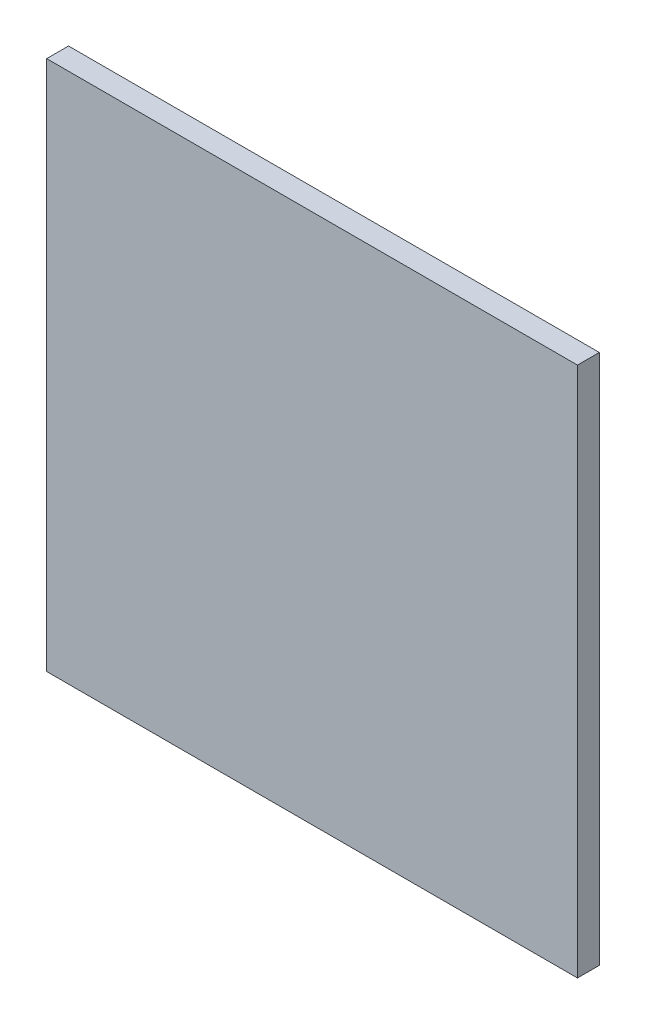
ISO-10303-21;
HEADER;
FILE_DESCRIPTION(('STEP AP214'),'2;1');
FILE_NAME('part.step','',(''),(''),'','','');
FILE_SCHEMA(('AUTOMOTIVE_DESIGN { 1 0 10303 214 1 1 1 1 }'));
ENDSEC;
DATA;
#1=APPLICATION_CONTEXT('core data for automotive mechanical design processes');
#2=APPLICATION_PROTOCOL_DEFINITION('international standard','automotive_design',2000,#1);
#3=PRODUCT_CONTEXT('',#1,'mechanical');
#4=PRODUCT('Part','Part','',(#3));
#5=PRODUCT_RELATED_PRODUCT_CATEGORY('part','',(#4));
#6=PRODUCT_DEFINITION_FORMATION('','',#4);
#7=PRODUCT_DEFINITION_CONTEXT('part definition',#1,'design');
#8=PRODUCT_DEFINITION('design','',#6,#7);
#9=PRODUCT_DEFINITION_SHAPE('','',#8);
#10=(LENGTH_UNIT() NAMED_UNIT(*) SI_UNIT(.MILLI.,.METRE.));
#11=(NAMED_UNIT(*) PLANE_ANGLE_UNIT() SI_UNIT($,.RADIAN.));
#12=(NAMED_UNIT(*) SI_UNIT($,.STERADIAN.) SOLID_ANGLE_UNIT());
#13=UNCERTAINTY_MEASURE_WITH_UNIT(LENGTH_MEASURE(1.E-05),#10,'distance_accuracy_value','');
#14=(GEOMETRIC_REPRESENTATION_CONTEXT(3) GLOBAL_UNCERTAINTY_ASSIGNED_CONTEXT((#13)) GLOBAL_UNIT_ASSIGNED_CONTEXT((#10,
#11,#12)) REPRESENTATION_CONTEXT('',''));
#15=CARTESIAN_POINT('',(0.,0.,0.));
#16=DIRECTION('',(0.,0.,1.));
#17=DIRECTION('',(1.,0.,0.));
#18=AXIS2_PLACEMENT_3D('',#15,#16,#17);
#19=CARTESIAN_POINT('',(170.,170.,14.));
#20=DIRECTION('',(-1.,0.,0.));
#21=DIRECTION('',(0.,-1.,0.));
#22=AXIS2_PLACEMENT_3D('',#19,#20,#21);
#23=PLANE('',#22);
#24=DIRECTION('',(0.,1.,0.));
#25=VECTOR('',#24,1.);
#26=CARTESIAN_POINT('',(170.,170.,0.));
#27=LINE('',#26,#25);
#28=CARTESIAN_POINT('',(170.,-170.,0.));
#29=VERTEX_POINT('',#28);
#30=CARTESIAN_POINT('',(170.,170.,0.));
#31=VERTEX_POINT('',#30);
#32=EDGE_CURVE('E98',#29,#31,#27,.T.);
#33=ORIENTED_EDGE('',*,*,#32,.T.);
#34=DIRECTION('',(0.,0.,-1.));
#35=VECTOR('',#34,1.);
#36=CARTESIAN_POINT('',(170.,170.,14.));
#37=LINE('',#36,#35);
#38=CARTESIAN_POINT('',(170.,170.,14.));
#39=VERTEX_POINT('',#38);
#40=EDGE_CURVE('E11',#39,#31,#37,.T.);
#41=ORIENTED_EDGE('',*,*,#40,.F.);
#42=DIRECTION('',(0.,1.,0.));
#43=VECTOR('',#42,1.);
#44=CARTESIAN_POINT('',(170.,170.,14.));
#45=LINE('',#44,#43);
#46=CARTESIAN_POINT('',(170.,-170.,14.));
#47=VERTEX_POINT('',#46);
#48=EDGE_CURVE('E86',#47,#39,#45,.T.);
#49=ORIENTED_EDGE('',*,*,#48,.F.);
#50=DIRECTION('',(0.,0.,-1.));
#51=VECTOR('',#50,1.);
#52=CARTESIAN_POINT('',(170.,-170.,14.));
#53=LINE('',#52,#51);
#54=EDGE_CURVE('E94',#47,#29,#53,.T.);
#55=ORIENTED_EDGE('',*,*,#54,.T.);
#56=EDGE_LOOP('',(#33,#41,#49,#55));
#57=FACE_BOUND('',#56,.T.);
#58=ADVANCED_FACE('F35',(#57),#23,.F.);
#59=CARTESIAN_POINT('',(-170.,170.,14.));
#60=DIRECTION('',(0.,-1.,0.));
#61=DIRECTION('',(0.,0.,-1.));
#62=AXIS2_PLACEMENT_3D('',#59,#60,#61);
#63=PLANE('',#62);
#64=DIRECTION('',(-1.,0.,0.));
#65=VECTOR('',#64,1.);
#66=CARTESIAN_POINT('',(-170.,170.,0.));
#67=LINE('',#66,#65);
#68=CARTESIAN_POINT('',(-170.,170.,0.));
#69=VERTEX_POINT('',#68);
#70=EDGE_CURVE('E90',#31,#69,#67,.T.);
#71=ORIENTED_EDGE('',*,*,#70,.T.);
#72=DIRECTION('',(0.,0.,-1.));
#73=VECTOR('',#72,1.);
#74=CARTESIAN_POINT('',(-170.,170.,14.));
#75=LINE('',#74,#73);
#76=CARTESIAN_POINT('',(-170.,170.,14.));
#77=VERTEX_POINT('',#76);
#78=EDGE_CURVE('E43',#77,#69,#75,.T.);
#79=ORIENTED_EDGE('',*,*,#78,.F.);
#80=DIRECTION('',(-1.,0.,0.));
#81=VECTOR('',#80,1.);
#82=CARTESIAN_POINT('',(-170.,170.,14.));
#83=LINE('',#82,#81);
#84=EDGE_CURVE('E81',#39,#77,#83,.T.);
#85=ORIENTED_EDGE('',*,*,#84,.F.);
#86=ORIENTED_EDGE('',*,*,#40,.T.);
#87=EDGE_LOOP('',(#71,#79,#85,#86));
#88=FACE_BOUND('',#87,.T.);
#89=ADVANCED_FACE('F89',(#88),#63,.F.);
#90=CARTESIAN_POINT('',(-170.,170.,14.));
#91=DIRECTION('',(1.,0.,0.));
#92=DIRECTION('',(0.,1.,0.));
#93=AXIS2_PLACEMENT_3D('',#90,#91,#92);
#94=PLANE('',#93);
#95=DIRECTION('',(0.,-1.,0.));
#96=VECTOR('',#95,1.);
#97=CARTESIAN_POINT('',(-170.,170.,0.));
#98=LINE('',#97,#96);
#99=CARTESIAN_POINT('',(-170.,-170.,0.));
#100=VERTEX_POINT('',#99);
#101=EDGE_CURVE('E68',#69,#100,#98,.T.);
#102=ORIENTED_EDGE('',*,*,#101,.T.);
#103=DIRECTION('',(0.,0.,-1.));
#104=VECTOR('',#103,1.);
#105=CARTESIAN_POINT('',(-170.,-170.,14.));
#106=LINE('',#105,#104);
#107=CARTESIAN_POINT('',(-170.,-170.,14.));
#108=VERTEX_POINT('',#107);
#109=EDGE_CURVE('E91',#108,#100,#106,.T.);
#110=ORIENTED_EDGE('',*,*,#109,.F.);
#111=DIRECTION('',(0.,-1.,0.));
#112=VECTOR('',#111,1.);
#113=CARTESIAN_POINT('',(-170.,170.,14.));
#114=LINE('',#113,#112);
#115=EDGE_CURVE('E84',#77,#108,#114,.T.);
#116=ORIENTED_EDGE('',*,*,#115,.F.);
#117=ORIENTED_EDGE('',*,*,#78,.T.);
#118=EDGE_LOOP('',(#102,#110,#116,#117));
#119=FACE_BOUND('',#118,.T.);
#120=ADVANCED_FACE('F92',(#119),#94,.F.);
#121=CARTESIAN_POINT('',(-170.,-170.,14.));
#122=DIRECTION('',(0.,1.,0.));
#123=DIRECTION('',(0.,0.,1.));
#124=AXIS2_PLACEMENT_3D('',#121,#122,#123);
#125=PLANE('',#124);
#126=DIRECTION('',(1.,0.,0.));
#127=VECTOR('',#126,1.);
#128=CARTESIAN_POINT('',(-170.,-170.,0.));
#129=LINE('',#128,#127);
#130=EDGE_CURVE('E74',#100,#29,#129,.T.);
#131=ORIENTED_EDGE('',*,*,#130,.T.);
#132=ORIENTED_EDGE('',*,*,#54,.F.);
#133=DIRECTION('',(1.,0.,0.));
#134=VECTOR('',#133,1.);
#135=CARTESIAN_POINT('',(-170.,-170.,14.));
#136=LINE('',#135,#134);
#137=EDGE_CURVE('E51',#108,#47,#136,.T.);
#138=ORIENTED_EDGE('',*,*,#137,.F.);
#139=ORIENTED_EDGE('',*,*,#109,.T.);
#140=EDGE_LOOP('',(#131,#132,#138,#139));
#141=FACE_BOUND('',#140,.T.);
#142=ADVANCED_FACE('F105',(#141),#125,.F.);
#143=CARTESIAN_POINT('',(0.,0.,14.));
#144=DIRECTION('',(0.,0.,1.));
#145=DIRECTION('',(1.,0.,0.));
#146=AXIS2_PLACEMENT_3D('',#143,#144,#145);
#147=PLANE('',#146);
#148=ORIENTED_EDGE('',*,*,#48,.T.);
#149=ORIENTED_EDGE('',*,*,#84,.T.);
#150=ORIENTED_EDGE('',*,*,#115,.T.);
#151=ORIENTED_EDGE('',*,*,#137,.T.);
#152=EDGE_LOOP('',(#148,#149,#150,#151));
#153=FACE_BOUND('',#152,.T.);
#154=ADVANCED_FACE('F82',(#153),#147,.T.);
#155=CARTESIAN_POINT('',(0.,0.,0.));
#156=DIRECTION('',(0.,0.,1.));
#157=DIRECTION('',(1.,0.,0.));
#158=AXIS2_PLACEMENT_3D('',#155,#156,#157);
#159=PLANE('',#158);
#160=ORIENTED_EDGE('',*,*,#32,.F.);
#161=ORIENTED_EDGE('',*,*,#130,.F.);
#162=ORIENTED_EDGE('',*,*,#101,.F.);
#163=ORIENTED_EDGE('',*,*,#70,.F.);
#164=EDGE_LOOP('',(#160,#161,#162,#163));
#165=FACE_BOUND('',#164,.T.);
#166=ADVANCED_FACE('F108',(#165),#159,.F.);
#167=CLOSED_SHELL('',(#58,#89,#120,#142,#154,#166));
#168=MANIFOLD_SOLID_BREP('B2',#167);
#169=ADVANCED_BREP_SHAPE_REPRESENTATION('',(#18,#168),#14);
#170=SHAPE_DEFINITION_REPRESENTATION(#9,#169);
ENDSEC;
END-ISO-10303-21;
